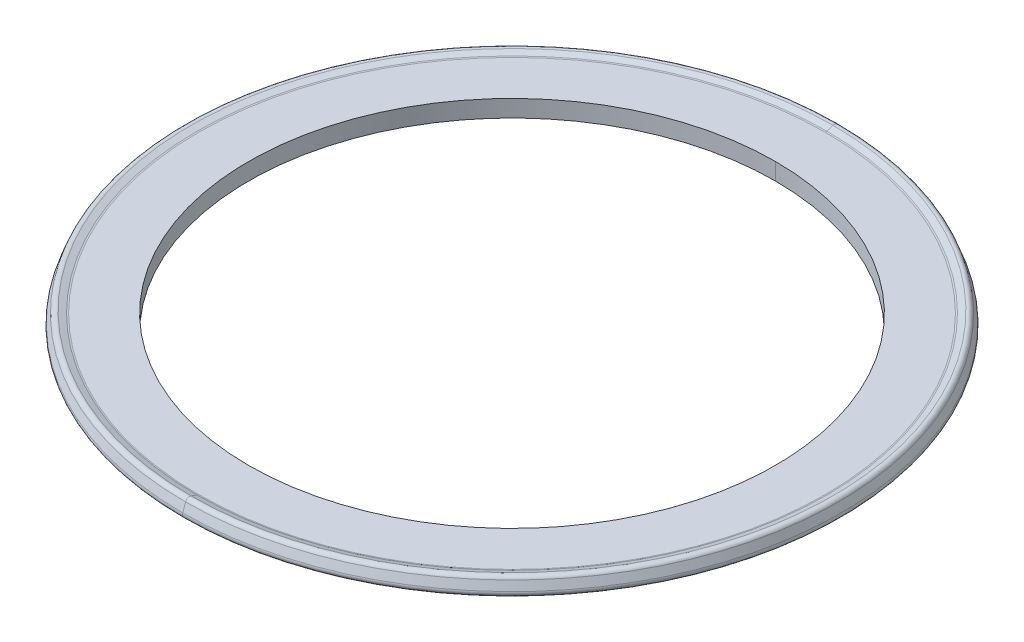
ISO-10303-21;
HEADER;
FILE_DESCRIPTION(('STEP AP214'),'2;1');
FILE_NAME('part.step','',(''),(''),'','','');
FILE_SCHEMA(('AUTOMOTIVE_DESIGN { 1 0 10303 214 1 1 1 1 }'));
ENDSEC;
DATA;
#1=APPLICATION_CONTEXT('core data for automotive mechanical design processes');
#2=APPLICATION_PROTOCOL_DEFINITION('international standard','automotive_design',2000,#1);
#3=PRODUCT_CONTEXT('',#1,'mechanical');
#4=PRODUCT('Part','Part','',(#3));
#5=PRODUCT_RELATED_PRODUCT_CATEGORY('part','',(#4));
#6=PRODUCT_DEFINITION_FORMATION('','',#4);
#7=PRODUCT_DEFINITION_CONTEXT('part definition',#1,'design');
#8=PRODUCT_DEFINITION('design','',#6,#7);
#9=PRODUCT_DEFINITION_SHAPE('','',#8);
#10=(LENGTH_UNIT() NAMED_UNIT(*) SI_UNIT(.MILLI.,.METRE.));
#11=(NAMED_UNIT(*) PLANE_ANGLE_UNIT() SI_UNIT($,.RADIAN.));
#12=(NAMED_UNIT(*) SI_UNIT($,.STERADIAN.) SOLID_ANGLE_UNIT());
#13=UNCERTAINTY_MEASURE_WITH_UNIT(LENGTH_MEASURE(1.E-05),#10,'distance_accuracy_value','');
#14=(GEOMETRIC_REPRESENTATION_CONTEXT(3) GLOBAL_UNCERTAINTY_ASSIGNED_CONTEXT((#13)) GLOBAL_UNIT_ASSIGNED_CONTEXT((#10,
#11,#12)) REPRESENTATION_CONTEXT('',''));
#15=CARTESIAN_POINT('',(0.,0.,0.));
#16=DIRECTION('',(0.,0.,1.));
#17=DIRECTION('',(1.,0.,0.));
#18=AXIS2_PLACEMENT_3D('',#15,#16,#17);
#19=CARTESIAN_POINT('',(0.,0.5,0.));
#20=DIRECTION('',(0.,-1.,0.));
#21=DIRECTION('',(0.,0.,-1.));
#22=AXIS2_PLACEMENT_3D('',#19,#20,#21);
#23=TOROIDAL_SURFACE('',#22,18.6174634903543,0.5);
#24=CARTESIAN_POINT('',(0.,0.5,18.6174634903543));
#25=DIRECTION('',(1.,0.,0.));
#26=DIRECTION('',(0.,0.,-1.));
#27=AXIS2_PLACEMENT_3D('',#24,#25,#26);
#28=CIRCLE('',#27,0.5);
#29=CARTESIAN_POINT('',(0.,0.0301536896070431,18.788473562017));
#30=VERTEX_POINT('',#29);
#31=CARTESIAN_POINT('',(0.,0.,18.6174634903543));
#32=VERTEX_POINT('',#31);
#33=EDGE_CURVE('E132',#30,#32,#28,.T.);
#34=ORIENTED_EDGE('',*,*,#33,.F.);
#35=CARTESIAN_POINT('',(0.,0.0301536896070431,0.));
#36=DIRECTION('',(0.,1.,0.));
#37=DIRECTION('',(0.,0.,1.));
#38=AXIS2_PLACEMENT_3D('',#35,#36,#37);
#39=CIRCLE('',#38,18.788473562017);
#40=CARTESIAN_POINT('',(0.,0.0301536896070431,-18.788473562017));
#41=VERTEX_POINT('',#40);
#42=EDGE_CURVE('E126',#41,#30,#39,.T.);
#43=ORIENTED_EDGE('',*,*,#42,.F.);
#44=CARTESIAN_POINT('',(0.,0.5,-18.6174634903543));
#45=DIRECTION('',(-1.,0.,0.));
#46=DIRECTION('',(0.,0.,1.));
#47=AXIS2_PLACEMENT_3D('',#44,#45,#46);
#48=CIRCLE('',#47,0.5);
#49=CARTESIAN_POINT('',(0.,0.,-18.6174634903543));
#50=VERTEX_POINT('',#49);
#51=EDGE_CURVE('E129',#41,#50,#48,.T.);
#52=ORIENTED_EDGE('',*,*,#51,.T.);
#53=CARTESIAN_POINT('',(0.,0.,0.));
#54=DIRECTION('',(0.,-1.,0.));
#55=DIRECTION('',(0.,0.,-1.));
#56=AXIS2_PLACEMENT_3D('',#53,#54,#55);
#57=CIRCLE('',#56,18.6174634903543);
#58=EDGE_CURVE('E27',#32,#50,#57,.T.);
#59=ORIENTED_EDGE('',*,*,#58,.F.);
#60=EDGE_LOOP('',(#34,#43,#52,#59));
#61=FACE_BOUND('',#60,.T.);
#62=ADVANCED_FACE('F17',(#61),#23,.T.);
#63=CARTESIAN_POINT('',(0.,0.908392563684307,0.));
#64=DIRECTION('',(0.,1.,0.));
#65=DIRECTION('',(0.,0.,1.));
#66=AXIS2_PLACEMENT_3D('',#63,#64,#65);
#67=TOROIDAL_SURFACE('',#66,19.0085617373093,0.25);
#68=CARTESIAN_POINT('',(0.,0.908392563684307,-19.0085617373093));
#69=DIRECTION('',(1.,0.,0.));
#70=DIRECTION('',(0.,0.,-1.));
#71=AXIS2_PLACEMENT_3D('',#68,#69,#70);
#72=CIRCLE('',#71,0.25);
#73=CARTESIAN_POINT('',(0.,0.993897599515723,-19.2434848925057));
#74=VERTEX_POINT('',#73);
#75=CARTESIAN_POINT('',(0.,1.14331571888078,-18.9230567014778));
#76=VERTEX_POINT('',#75);
#77=EDGE_CURVE('E233',#74,#76,#72,.T.);
#78=ORIENTED_EDGE('',*,*,#77,.F.);
#79=CARTESIAN_POINT('',(0.,0.993897599515723,0.));
#80=DIRECTION('',(0.,-1.,0.));
#81=DIRECTION('',(0.,0.,1.));
#82=AXIS2_PLACEMENT_3D('',#79,#80,#81);
#83=CIRCLE('',#82,19.2434848925057);
#84=CARTESIAN_POINT('',(0.,0.993897599515723,19.2434848925057));
#85=VERTEX_POINT('',#84);
#86=EDGE_CURVE('E82',#85,#74,#83,.T.);
#87=ORIENTED_EDGE('',*,*,#86,.F.);
#88=CARTESIAN_POINT('',(0.,0.908392563684307,19.0085617373093));
#89=DIRECTION('',(-1.,0.,0.));
#90=DIRECTION('',(0.,0.,1.));
#91=AXIS2_PLACEMENT_3D('',#88,#89,#90);
#92=CIRCLE('',#91,0.25);
#93=CARTESIAN_POINT('',(0.,1.14331571888078,18.9230567014778));
#94=VERTEX_POINT('',#93);
#95=EDGE_CURVE('E221',#85,#94,#92,.T.);
#96=ORIENTED_EDGE('',*,*,#95,.T.);
#97=CARTESIAN_POINT('',(0.,1.14331571888078,0.));
#98=DIRECTION('',(0.,1.,0.));
#99=DIRECTION('',(0.,0.,-1.));
#100=AXIS2_PLACEMENT_3D('',#97,#98,#99);
#101=CIRCLE('',#100,18.9230567014778);
#102=EDGE_CURVE('E67',#76,#94,#101,.T.);
#103=ORIENTED_EDGE('',*,*,#102,.F.);
#104=EDGE_LOOP('',(#78,#87,#96,#103));
#105=FACE_BOUND('',#104,.T.);
#106=ADVANCED_FACE('F292',(#105),#67,.T.);
#107=CARTESIAN_POINT('',(0.,0.438546253291353,0.));
#108=DIRECTION('',(0.,1.,0.));
#109=DIRECTION('',(0.,0.,1.));
#110=AXIS2_PLACEMENT_3D('',#107,#108,#109);
#111=TOROIDAL_SURFACE('',#110,19.1795718089721,0.25);
#112=CARTESIAN_POINT('',(0.,0.438546253291353,-19.1795718089721));
#113=DIRECTION('',(1.,0.,0.));
#114=DIRECTION('',(0.,0.,-1.));
#115=AXIS2_PLACEMENT_3D('',#112,#113,#114);
#116=CIRCLE('',#115,0.25);
#117=CARTESIAN_POINT('',(0.,0.203623098094875,-19.2650768448035));
#118=VERTEX_POINT('',#117);
#119=CARTESIAN_POINT('',(0.,0.524051289122779,-19.4144949641686));
#120=VERTEX_POINT('',#119);
#121=EDGE_CURVE('E230',#118,#120,#116,.T.);
#122=ORIENTED_EDGE('',*,*,#121,.F.);
#123=CARTESIAN_POINT('',(0.,0.203623098094875,0.));
#124=DIRECTION('',(0.,-1.,0.));
#125=DIRECTION('',(0.,0.,-1.));
#126=AXIS2_PLACEMENT_3D('',#123,#124,#125);
#127=CIRCLE('',#126,19.2650768448035);
#128=CARTESIAN_POINT('',(0.,0.203623098094875,19.2650768448035));
#129=VERTEX_POINT('',#128);
#130=EDGE_CURVE('E138',#129,#118,#127,.T.);
#131=ORIENTED_EDGE('',*,*,#130,.F.);
#132=CARTESIAN_POINT('',(0.,0.438546253291353,19.1795718089721));
#133=DIRECTION('',(-1.,0.,0.));
#134=DIRECTION('',(0.,0.,1.));
#135=AXIS2_PLACEMENT_3D('',#132,#133,#134);
#136=CIRCLE('',#135,0.25);
#137=CARTESIAN_POINT('',(0.,0.524051289122779,19.4144949641686));
#138=VERTEX_POINT('',#137);
#139=EDGE_CURVE('E217',#129,#138,#136,.T.);
#140=ORIENTED_EDGE('',*,*,#139,.T.);
#141=CARTESIAN_POINT('',(0.,0.524051289122779,0.));
#142=DIRECTION('',(0.,1.,0.));
#143=DIRECTION('',(0.,0.,1.));
#144=AXIS2_PLACEMENT_3D('',#141,#142,#143);
#145=CIRCLE('',#144,19.4144949641686);
#146=EDGE_CURVE('E139',#120,#138,#145,.T.);
#147=ORIENTED_EDGE('',*,*,#146,.F.);
#148=EDGE_LOOP('',(#122,#131,#140,#147));
#149=FACE_BOUND('',#148,.T.);
#150=ADVANCED_FACE('F286',(#149),#111,.T.);
#151=CARTESIAN_POINT('',(0.,1.25,0.));
#152=DIRECTION('',(0.,-1.,0.));
#153=DIRECTION('',(0.,0.,-1.));
#154=AXIS2_PLACEMENT_3D('',#151,#152,#153);
#155=TOROIDAL_SURFACE('',#154,18.4852182548229,0.25);
#156=CARTESIAN_POINT('',(0.,1.25,18.4852182548229));
#157=DIRECTION('',(1.,0.,0.));
#158=DIRECTION('',(0.,0.,-1.));
#159=AXIS2_PLACEMENT_3D('',#156,#157,#158);
#160=CIRCLE('',#159,0.25);
#161=CARTESIAN_POINT('',(0.,1.01507684480352,18.5707232906543));
#162=VERTEX_POINT('',#161);
#163=CARTESIAN_POINT('',(0.,1.,18.4852182548229));
#164=VERTEX_POINT('',#163);
#165=EDGE_CURVE('E216',#162,#164,#160,.T.);
#166=ORIENTED_EDGE('',*,*,#165,.F.);
#167=CARTESIAN_POINT('',(0.,1.01507684480352,0.));
#168=DIRECTION('',(0.,-1.,0.));
#169=DIRECTION('',(0.,0.,1.));
#170=AXIS2_PLACEMENT_3D('',#167,#168,#169);
#171=CIRCLE('',#170,18.5707232906543);
#172=CARTESIAN_POINT('',(0.,1.01507684480352,-18.5707232906543));
#173=VERTEX_POINT('',#172);
#174=EDGE_CURVE('E172',#173,#162,#171,.T.);
#175=ORIENTED_EDGE('',*,*,#174,.F.);
#176=CARTESIAN_POINT('',(0.,1.25,-18.4852182548229));
#177=DIRECTION('',(-1.,0.,0.));
#178=DIRECTION('',(0.,0.,1.));
#179=AXIS2_PLACEMENT_3D('',#176,#177,#178);
#180=CIRCLE('',#179,0.25);
#181=CARTESIAN_POINT('',(0.,1.,-18.4852182548229));
#182=VERTEX_POINT('',#181);
#183=EDGE_CURVE('E173',#173,#182,#180,.T.);
#184=ORIENTED_EDGE('',*,*,#183,.T.);
#185=CARTESIAN_POINT('',(0.,1.,0.));
#186=DIRECTION('',(0.,1.,0.));
#187=DIRECTION('',(0.,0.,-1.));
#188=AXIS2_PLACEMENT_3D('',#185,#186,#187);
#189=CIRCLE('',#188,18.4852182548229);
#190=EDGE_CURVE('E169',#164,#182,#189,.T.);
#191=ORIENTED_EDGE('',*,*,#190,.F.);
#192=EDGE_LOOP('',(#166,#175,#184,#191));
#193=FACE_BOUND('',#192,.T.);
#194=ADVANCED_FACE('F300',(#193),#155,.F.);
#195=CARTESIAN_POINT('',(0.,0.,0.));
#196=DIRECTION('',(0.,-1.,0.));
#197=DIRECTION('',(0.,0.,-1.));
#198=AXIS2_PLACEMENT_3D('',#195,#196,#197);
#199=CYLINDRICAL_SURFACE('',#198,15.525);
#200=DIRECTION('',(0.,-1.,0.));
#201=VECTOR('',#200,1.);
#202=CARTESIAN_POINT('',(0.,0.,15.525));
#203=LINE('',#202,#201);
#204=CARTESIAN_POINT('',(0.,1.,15.525));
#205=VERTEX_POINT('',#204);
#206=CARTESIAN_POINT('',(0.,0.,15.525));
#207=VERTEX_POINT('',#206);
#208=EDGE_CURVE('E212',#205,#207,#203,.T.);
#209=ORIENTED_EDGE('',*,*,#208,.F.);
#210=CARTESIAN_POINT('',(0.,1.,0.));
#211=DIRECTION('',(0.,-1.,0.));
#212=DIRECTION('',(0.,0.,-1.));
#213=AXIS2_PLACEMENT_3D('',#210,#211,#212);
#214=CIRCLE('',#213,15.525);
#215=CARTESIAN_POINT('',(0.,1.,-15.525));
#216=VERTEX_POINT('',#215);
#217=EDGE_CURVE('E206',#216,#205,#214,.T.);
#218=ORIENTED_EDGE('',*,*,#217,.F.);
#219=DIRECTION('',(0.,-1.,0.));
#220=VECTOR('',#219,1.);
#221=CARTESIAN_POINT('',(0.,0.,-15.525));
#222=LINE('',#221,#220);
#223=CARTESIAN_POINT('',(0.,0.,-15.525));
#224=VERTEX_POINT('',#223);
#225=EDGE_CURVE('E149',#216,#224,#222,.T.);
#226=ORIENTED_EDGE('',*,*,#225,.T.);
#227=CARTESIAN_POINT('',(0.,0.,0.));
#228=DIRECTION('',(0.,-1.,0.));
#229=DIRECTION('',(0.,0.,-1.));
#230=AXIS2_PLACEMENT_3D('',#227,#228,#229);
#231=CIRCLE('',#230,15.525);
#232=EDGE_CURVE('E11',#224,#207,#231,.T.);
#233=ORIENTED_EDGE('',*,*,#232,.T.);
#234=EDGE_LOOP('',(#209,#218,#226,#233));
#235=FACE_BOUND('',#234,.T.);
#236=ADVANCED_FACE('F327',(#235),#199,.F.);
#237=CARTESIAN_POINT('',(0.,0.,0.));
#238=DIRECTION('',(0.,-1.,0.));
#239=DIRECTION('',(0.,0.,-1.));
#240=AXIS2_PLACEMENT_3D('',#237,#238,#239);
#241=PLANE('',#240);
#242=ORIENTED_EDGE('',*,*,#232,.F.);
#243=CARTESIAN_POINT('',(0.,0.,0.));
#244=DIRECTION('',(0.,-1.,0.));
#245=DIRECTION('',(0.,0.,-1.));
#246=AXIS2_PLACEMENT_3D('',#243,#244,#245);
#247=CIRCLE('',#246,15.525);
#248=EDGE_CURVE('E209',#207,#224,#247,.T.);
#249=ORIENTED_EDGE('',*,*,#248,.F.);
#250=EDGE_LOOP('',(#242,#249));
#251=FACE_BOUND('',#250,.T.);
#252=CARTESIAN_POINT('',(0.,0.,0.));
#253=DIRECTION('',(0.,-1.,0.));
#254=DIRECTION('',(0.,0.,-1.));
#255=AXIS2_PLACEMENT_3D('',#252,#253,#254);
#256=CIRCLE('',#255,18.6174634903543);
#257=EDGE_CURVE('E154',#50,#32,#256,.T.);
#258=ORIENTED_EDGE('',*,*,#257,.T.);
#259=ORIENTED_EDGE('',*,*,#58,.T.);
#260=EDGE_LOOP('',(#258,#259));
#261=FACE_BOUND('',#260,.T.);
#262=ADVANCED_FACE('F330',(#251,#261),#241,.T.);
#263=CARTESIAN_POINT('',(0.,0.289128133926292,0.));
#264=DIRECTION('',(0.,1.,0.));
#265=DIRECTION('',(0.,0.,1.));
#266=AXIS2_PLACEMENT_3D('',#263,#264,#265);
#267=CONICAL_SURFACE('',#266,19.5,1.22173047639603);
#268=DIRECTION('',(0.,0.342020143325669,-0.939692620785908));
#269=VECTOR('',#268,1.);
#270=CARTESIAN_POINT('',(0.,0.289128133926292,-19.5));
#271=LINE('',#270,#269);
#272=EDGE_CURVE('E20',#41,#118,#271,.T.);
#273=ORIENTED_EDGE('',*,*,#272,.F.);
#274=ORIENTED_EDGE('',*,*,#42,.T.);
#275=DIRECTION('',(0.,0.342020143325669,0.939692620785908));
#276=VECTOR('',#275,1.);
#277=CARTESIAN_POINT('',(0.,0.289128133926292,19.5));
#278=LINE('',#277,#276);
#279=EDGE_CURVE('E148',#30,#129,#278,.T.);
#280=ORIENTED_EDGE('',*,*,#279,.T.);
#281=ORIENTED_EDGE('',*,*,#130,.T.);
#282=EDGE_LOOP('',(#273,#274,#280,#281));
#283=FACE_BOUND('',#282,.T.);
#284=ADVANCED_FACE('F142',(#283),#267,.T.);
#285=CARTESIAN_POINT('',(0.,1.2288207547122,0.));
#286=DIRECTION('',(0.,-1.,0.));
#287=DIRECTION('',(0.,0.,-1.));
#288=AXIS2_PLACEMENT_3D('',#285,#286,#287);
#289=CONICAL_SURFACE('',#288,19.1579798566743,0.34906585039887);
#290=DIRECTION('',(0.,-0.939692620785907,0.342020143325672));
#291=VECTOR('',#290,1.);
#292=CARTESIAN_POINT('',(0.,1.2288207547122,19.1579798566743));
#293=LINE('',#292,#291);
#294=EDGE_CURVE('E192',#85,#138,#293,.T.);
#295=ORIENTED_EDGE('',*,*,#294,.F.);
#296=ORIENTED_EDGE('',*,*,#86,.T.);
#297=DIRECTION('',(0.,-0.939692620785907,-0.342020143325672));
#298=VECTOR('',#297,1.);
#299=CARTESIAN_POINT('',(0.,1.2288207547122,-19.1579798566743));
#300=LINE('',#299,#298);
#301=EDGE_CURVE('E181',#74,#120,#300,.T.);
#302=ORIENTED_EDGE('',*,*,#301,.T.);
#303=ORIENTED_EDGE('',*,*,#146,.T.);
#304=EDGE_LOOP('',(#295,#296,#302,#303));
#305=FACE_BOUND('',#304,.T.);
#306=ADVANCED_FACE('F287',(#305),#289,.T.);
#307=CARTESIAN_POINT('',(0.,1.,0.));
#308=DIRECTION('',(0.,1.,0.));
#309=DIRECTION('',(0.,0.,1.));
#310=AXIS2_PLACEMENT_3D('',#307,#308,#309);
#311=CONICAL_SURFACE('',#310,18.5293,1.22173047639603);
#312=DIRECTION('',(0.,0.34202014332567,-0.939692620785908));
#313=VECTOR('',#312,1.);
#314=CARTESIAN_POINT('',(0.,1.,-18.5293));
#315=LINE('',#314,#313);
#316=EDGE_CURVE('E179',#173,#76,#315,.T.);
#317=ORIENTED_EDGE('',*,*,#316,.F.);
#318=ORIENTED_EDGE('',*,*,#174,.T.);
#319=DIRECTION('',(0.,0.34202014332567,0.939692620785908));
#320=VECTOR('',#319,1.);
#321=CARTESIAN_POINT('',(0.,1.,18.5293));
#322=LINE('',#321,#320);
#323=EDGE_CURVE('E167',#162,#94,#322,.T.);
#324=ORIENTED_EDGE('',*,*,#323,.T.);
#325=CARTESIAN_POINT('',(0.,1.14331571888078,0.));
#326=DIRECTION('',(0.,1.,0.));
#327=DIRECTION('',(0.,0.,-1.));
#328=AXIS2_PLACEMENT_3D('',#325,#326,#327);
#329=CIRCLE('',#328,18.9230567014778);
#330=EDGE_CURVE('E224',#94,#76,#329,.T.);
#331=ORIENTED_EDGE('',*,*,#330,.T.);
#332=EDGE_LOOP('',(#317,#318,#324,#331));
#333=FACE_BOUND('',#332,.T.);
#334=ADVANCED_FACE('F315',(#333),#311,.F.);
#335=CARTESIAN_POINT('',(0.,1.,0.));
#336=DIRECTION('',(0.,-1.,0.));
#337=DIRECTION('',(0.,0.,-1.));
#338=AXIS2_PLACEMENT_3D('',#335,#336,#337);
#339=PLANE('',#338);
#340=ORIENTED_EDGE('',*,*,#217,.T.);
#341=CARTESIAN_POINT('',(0.,1.,0.));
#342=DIRECTION('',(0.,-1.,0.));
#343=DIRECTION('',(0.,0.,-1.));
#344=AXIS2_PLACEMENT_3D('',#341,#342,#343);
#345=CIRCLE('',#344,15.525);
#346=EDGE_CURVE('E177',#205,#216,#345,.T.);
#347=ORIENTED_EDGE('',*,*,#346,.T.);
#348=EDGE_LOOP('',(#340,#347));
#349=FACE_BOUND('',#348,.T.);
#350=CARTESIAN_POINT('',(0.,1.,0.));
#351=DIRECTION('',(0.,1.,0.));
#352=DIRECTION('',(0.,0.,-1.));
#353=AXIS2_PLACEMENT_3D('',#350,#351,#352);
#354=CIRCLE('',#353,18.4852182548229);
#355=EDGE_CURVE('E178',#182,#164,#354,.T.);
#356=ORIENTED_EDGE('',*,*,#355,.T.);
#357=ORIENTED_EDGE('',*,*,#190,.T.);
#358=EDGE_LOOP('',(#356,#357));
#359=FACE_BOUND('',#358,.T.);
#360=ADVANCED_FACE('F326',(#349,#359),#339,.F.);
#361=CARTESIAN_POINT('',(0.,1.,0.));
#362=DIRECTION('',(0.,1.,0.));
#363=DIRECTION('',(0.,0.,1.));
#364=AXIS2_PLACEMENT_3D('',#361,#362,#363);
#365=CONICAL_SURFACE('',#364,18.5293,1.22173047639603);
#366=CARTESIAN_POINT('',(0.,1.01507684480352,0.));
#367=DIRECTION('',(0.,-1.,0.));
#368=DIRECTION('',(0.,0.,1.));
#369=AXIS2_PLACEMENT_3D('',#366,#367,#368);
#370=CIRCLE('',#369,18.5707232906543);
#371=EDGE_CURVE('E214',#162,#173,#370,.T.);
#372=ORIENTED_EDGE('',*,*,#371,.T.);
#373=ORIENTED_EDGE('',*,*,#316,.T.);
#374=ORIENTED_EDGE('',*,*,#102,.T.);
#375=ORIENTED_EDGE('',*,*,#323,.F.);
#376=EDGE_LOOP('',(#372,#373,#374,#375));
#377=FACE_BOUND('',#376,.T.);
#378=ADVANCED_FACE('F323',(#377),#365,.F.);
#379=CARTESIAN_POINT('',(0.,1.2288207547122,0.));
#380=DIRECTION('',(0.,-1.,0.));
#381=DIRECTION('',(0.,0.,-1.));
#382=AXIS2_PLACEMENT_3D('',#379,#380,#381);
#383=CONICAL_SURFACE('',#382,19.1579798566743,0.34906585039887);
#384=CARTESIAN_POINT('',(0.,0.993897599515723,0.));
#385=DIRECTION('',(0.,-1.,0.));
#386=DIRECTION('',(0.,0.,1.));
#387=AXIS2_PLACEMENT_3D('',#384,#385,#386);
#388=CIRCLE('',#387,19.2434848925057);
#389=EDGE_CURVE('E156',#74,#85,#388,.T.);
#390=ORIENTED_EDGE('',*,*,#389,.T.);
#391=ORIENTED_EDGE('',*,*,#294,.T.);
#392=CARTESIAN_POINT('',(0.,0.524051289122779,0.));
#393=DIRECTION('',(0.,1.,0.));
#394=DIRECTION('',(0.,0.,1.));
#395=AXIS2_PLACEMENT_3D('',#392,#393,#394);
#396=CIRCLE('',#395,19.4144949641686);
#397=EDGE_CURVE('E255',#138,#120,#396,.T.);
#398=ORIENTED_EDGE('',*,*,#397,.T.);
#399=ORIENTED_EDGE('',*,*,#301,.F.);
#400=EDGE_LOOP('',(#390,#391,#398,#399));
#401=FACE_BOUND('',#400,.T.);
#402=ADVANCED_FACE('F288',(#401),#383,.T.);
#403=CARTESIAN_POINT('',(0.,0.289128133926292,0.));
#404=DIRECTION('',(0.,1.,0.));
#405=DIRECTION('',(0.,0.,1.));
#406=AXIS2_PLACEMENT_3D('',#403,#404,#405);
#407=CONICAL_SURFACE('',#406,19.5,1.22173047639603);
#408=CARTESIAN_POINT('',(0.,0.0301536896070431,0.));
#409=DIRECTION('',(0.,1.,0.));
#410=DIRECTION('',(0.,0.,1.));
#411=AXIS2_PLACEMENT_3D('',#408,#409,#410);
#412=CIRCLE('',#411,18.788473562017);
#413=EDGE_CURVE('E152',#30,#41,#412,.T.);
#414=ORIENTED_EDGE('',*,*,#413,.T.);
#415=ORIENTED_EDGE('',*,*,#272,.T.);
#416=CARTESIAN_POINT('',(0.,0.203623098094875,0.));
#417=DIRECTION('',(0.,-1.,0.));
#418=DIRECTION('',(0.,0.,-1.));
#419=AXIS2_PLACEMENT_3D('',#416,#417,#418);
#420=CIRCLE('',#419,19.2650768448035);
#421=EDGE_CURVE('E223',#118,#129,#420,.T.);
#422=ORIENTED_EDGE('',*,*,#421,.T.);
#423=ORIENTED_EDGE('',*,*,#279,.F.);
#424=EDGE_LOOP('',(#414,#415,#422,#423));
#425=FACE_BOUND('',#424,.T.);
#426=ADVANCED_FACE('F158',(#425),#407,.T.);
#427=CARTESIAN_POINT('',(0.,0.,0.));
#428=DIRECTION('',(0.,-1.,0.));
#429=DIRECTION('',(0.,0.,-1.));
#430=AXIS2_PLACEMENT_3D('',#427,#428,#429);
#431=CYLINDRICAL_SURFACE('',#430,15.525);
#432=ORIENTED_EDGE('',*,*,#346,.F.);
#433=ORIENTED_EDGE('',*,*,#208,.T.);
#434=ORIENTED_EDGE('',*,*,#248,.T.);
#435=ORIENTED_EDGE('',*,*,#225,.F.);
#436=EDGE_LOOP('',(#432,#433,#434,#435));
#437=FACE_BOUND('',#436,.T.);
#438=ADVANCED_FACE('F304',(#437),#431,.F.);
#439=CARTESIAN_POINT('',(0.,1.25,0.));
#440=DIRECTION('',(0.,-1.,0.));
#441=DIRECTION('',(0.,0.,-1.));
#442=AXIS2_PLACEMENT_3D('',#439,#440,#441);
#443=TOROIDAL_SURFACE('',#442,18.4852182548229,0.25);
#444=ORIENTED_EDGE('',*,*,#371,.F.);
#445=ORIENTED_EDGE('',*,*,#165,.T.);
#446=ORIENTED_EDGE('',*,*,#355,.F.);
#447=ORIENTED_EDGE('',*,*,#183,.F.);
#448=EDGE_LOOP('',(#444,#445,#446,#447));
#449=FACE_BOUND('',#448,.T.);
#450=ADVANCED_FACE('F307',(#449),#443,.F.);
#451=CARTESIAN_POINT('',(0.,0.438546253291353,0.));
#452=DIRECTION('',(0.,1.,0.));
#453=DIRECTION('',(0.,0.,1.));
#454=AXIS2_PLACEMENT_3D('',#451,#452,#453);
#455=TOROIDAL_SURFACE('',#454,19.1795718089721,0.25);
#456=ORIENTED_EDGE('',*,*,#421,.F.);
#457=ORIENTED_EDGE('',*,*,#121,.T.);
#458=ORIENTED_EDGE('',*,*,#397,.F.);
#459=ORIENTED_EDGE('',*,*,#139,.F.);
#460=EDGE_LOOP('',(#456,#457,#458,#459));
#461=FACE_BOUND('',#460,.T.);
#462=ADVANCED_FACE('F284',(#461),#455,.T.);
#463=CARTESIAN_POINT('',(0.,0.908392563684307,0.));
#464=DIRECTION('',(0.,1.,0.));
#465=DIRECTION('',(0.,0.,1.));
#466=AXIS2_PLACEMENT_3D('',#463,#464,#465);
#467=TOROIDAL_SURFACE('',#466,19.0085617373093,0.25);
#468=ORIENTED_EDGE('',*,*,#389,.F.);
#469=ORIENTED_EDGE('',*,*,#77,.T.);
#470=ORIENTED_EDGE('',*,*,#330,.F.);
#471=ORIENTED_EDGE('',*,*,#95,.F.);
#472=EDGE_LOOP('',(#468,#469,#470,#471));
#473=FACE_BOUND('',#472,.T.);
#474=ADVANCED_FACE('F291',(#473),#467,.T.);
#475=CARTESIAN_POINT('',(0.,0.5,0.));
#476=DIRECTION('',(0.,-1.,0.));
#477=DIRECTION('',(0.,0.,-1.));
#478=AXIS2_PLACEMENT_3D('',#475,#476,#477);
#479=TOROIDAL_SURFACE('',#478,18.6174634903543,0.5);
#480=ORIENTED_EDGE('',*,*,#413,.F.);
#481=ORIENTED_EDGE('',*,*,#33,.T.);
#482=ORIENTED_EDGE('',*,*,#257,.F.);
#483=ORIENTED_EDGE('',*,*,#51,.F.);
#484=EDGE_LOOP('',(#480,#481,#482,#483));
#485=FACE_BOUND('',#484,.T.);
#486=ADVANCED_FACE('F151',(#485),#479,.T.);
#487=CLOSED_SHELL('',(#62,#106,#150,#194,#236,#262,#284,#306,#334,#360,#378,#402,#426,#438,#450,
#462,#474,#486));
#488=MANIFOLD_SOLID_BREP('B1',#487);
#489=ADVANCED_BREP_SHAPE_REPRESENTATION('',(#18,#488),#14);
#490=SHAPE_DEFINITION_REPRESENTATION(#9,#489);
ENDSEC;
END-ISO-10303-21;
